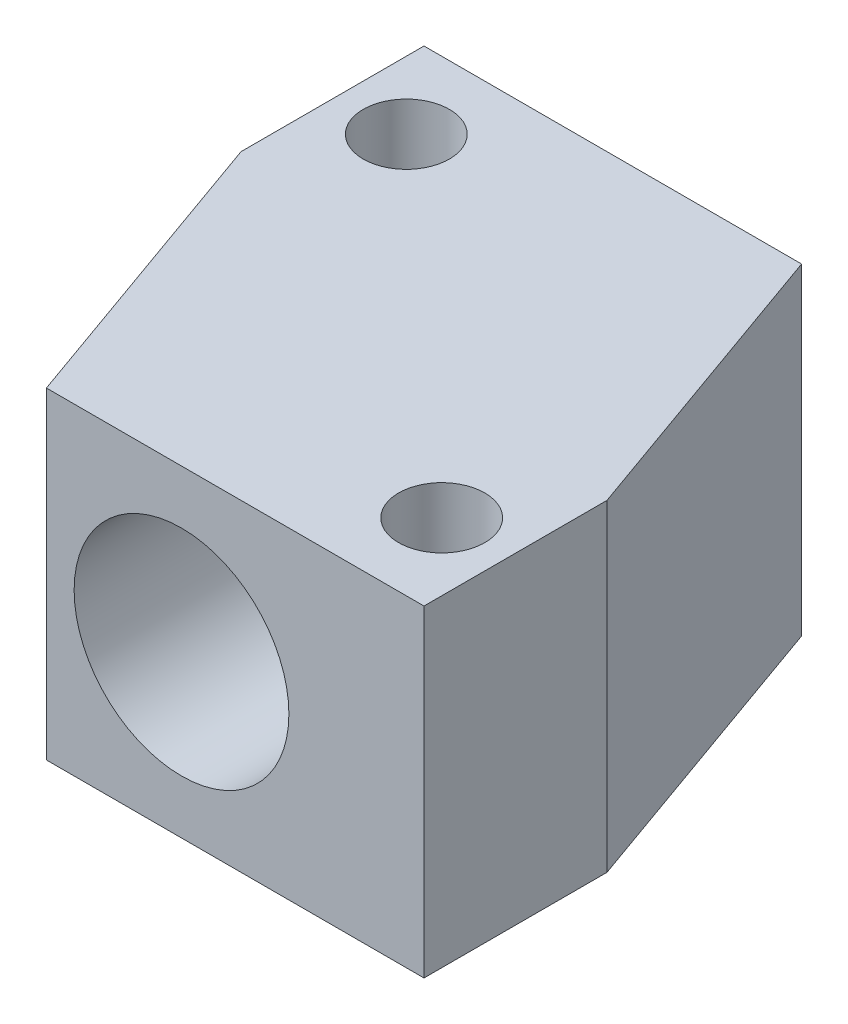
ISO-10303-21;
HEADER;
FILE_DESCRIPTION(('STEP AP214'),'2;1');
FILE_NAME('part.step','',(''),(''),'','','');
FILE_SCHEMA(('AUTOMOTIVE_DESIGN { 1 0 10303 214 1 1 1 1 }'));
ENDSEC;
DATA;
#1=APPLICATION_CONTEXT('core data for automotive mechanical design processes');
#2=APPLICATION_PROTOCOL_DEFINITION('international standard','automotive_design',2000,#1);
#3=PRODUCT_CONTEXT('',#1,'mechanical');
#4=PRODUCT('Part','Part','',(#3));
#5=PRODUCT_RELATED_PRODUCT_CATEGORY('part','',(#4));
#6=PRODUCT_DEFINITION_FORMATION('','',#4);
#7=PRODUCT_DEFINITION_CONTEXT('part definition',#1,'design');
#8=PRODUCT_DEFINITION('design','',#6,#7);
#9=PRODUCT_DEFINITION_SHAPE('','',#8);
#10=(LENGTH_UNIT() NAMED_UNIT(*) SI_UNIT(.MILLI.,.METRE.));
#11=(NAMED_UNIT(*) PLANE_ANGLE_UNIT() SI_UNIT($,.RADIAN.));
#12=(NAMED_UNIT(*) SI_UNIT($,.STERADIAN.) SOLID_ANGLE_UNIT());
#13=UNCERTAINTY_MEASURE_WITH_UNIT(LENGTH_MEASURE(1.E-05),#10,'distance_accuracy_value','');
#14=(GEOMETRIC_REPRESENTATION_CONTEXT(3) GLOBAL_UNCERTAINTY_ASSIGNED_CONTEXT((#13)) GLOBAL_UNIT_ASSIGNED_CONTEXT((#10,
#11,#12)) REPRESENTATION_CONTEXT('',''));
#15=CARTESIAN_POINT('',(0.,0.,0.));
#16=DIRECTION('',(0.,0.,1.));
#17=DIRECTION('',(1.,0.,0.));
#18=AXIS2_PLACEMENT_3D('',#15,#16,#17);
#19=CARTESIAN_POINT('',(-26.0675,-12.,-23.43));
#20=DIRECTION('',(0.,1.,0.));
#21=DIRECTION('',(0.,0.,1.));
#22=AXIS2_PLACEMENT_3D('',#19,#20,#21);
#23=CYLINDRICAL_SURFACE('',#22,3.39);
#24=CARTESIAN_POINT('',(-26.0675,-36.,-23.43));
#25=DIRECTION('',(0.,1.,0.));
#26=DIRECTION('',(0.,0.,1.));
#27=AXIS2_PLACEMENT_3D('',#24,#25,#26);
#28=CIRCLE('',#27,3.39);
#29=CARTESIAN_POINT('',(-26.0675,-36.,-20.04));
#30=VERTEX_POINT('',#29);
#31=EDGE_CURVE('E125',#30,#30,#28,.T.);
#32=ORIENTED_EDGE('',*,*,#31,.F.);
#33=EDGE_LOOP('',(#32));
#34=FACE_BOUND('',#33,.T.);
#35=CARTESIAN_POINT('',(-26.0675,1.58,-23.43));
#36=DIRECTION('',(0.,1.,0.));
#37=DIRECTION('',(0.,0.,1.));
#38=AXIS2_PLACEMENT_3D('',#35,#36,#37);
#39=CIRCLE('',#38,3.39);
#40=CARTESIAN_POINT('',(-26.0675,1.58,-20.04));
#41=VERTEX_POINT('',#40);
#42=EDGE_CURVE('E155',#41,#41,#39,.F.);
#43=ORIENTED_EDGE('',*,*,#42,.F.);
#44=EDGE_LOOP('',(#43));
#45=FACE_BOUND('',#44,.T.);
#46=ADVANCED_FACE('F38',(#34,#45),#23,.F.);
#47=CARTESIAN_POINT('',(0.,0.,36.13));
#48=DIRECTION('',(0.,0.,1.));
#49=DIRECTION('',(1.,0.,0.));
#50=AXIS2_PLACEMENT_3D('',#47,#48,#49);
#51=PLANE('',#50);
#52=DIRECTION('',(0.,1.,0.));
#53=VECTOR('',#52,1.);
#54=CARTESIAN_POINT('',(-20.13,-36.,36.13));
#55=LINE('',#54,#53);
#56=CARTESIAN_POINT('',(-20.13,-36.,36.13));
#57=VERTEX_POINT('',#56);
#58=CARTESIAN_POINT('',(-20.13,12.,36.13));
#59=VERTEX_POINT('',#58);
#60=EDGE_CURVE('E94',#57,#59,#55,.T.);
#61=ORIENTED_EDGE('',*,*,#60,.F.);
#62=DIRECTION('',(-1.,0.,0.));
#63=VECTOR('',#62,1.);
#64=CARTESIAN_POINT('',(-36.13,-36.,36.13));
#65=LINE('',#64,#63);
#66=CARTESIAN_POINT('',(36.13,-36.,36.13));
#67=VERTEX_POINT('',#66);
#68=EDGE_CURVE('E108',#67,#57,#65,.T.);
#69=ORIENTED_EDGE('',*,*,#68,.F.);
#70=DIRECTION('',(0.,1.,0.));
#71=VECTOR('',#70,1.);
#72=CARTESIAN_POINT('',(36.13,12.,36.13));
#73=LINE('',#72,#71);
#74=CARTESIAN_POINT('',(36.13,12.,36.13));
#75=VERTEX_POINT('',#74);
#76=EDGE_CURVE('E142',#67,#75,#73,.T.);
#77=ORIENTED_EDGE('',*,*,#76,.T.);
#78=DIRECTION('',(-1.,0.,0.));
#79=VECTOR('',#78,1.);
#80=CARTESIAN_POINT('',(-36.13,12.,36.13));
#81=LINE('',#80,#79);
#82=EDGE_CURVE('E109',#75,#59,#81,.T.);
#83=ORIENTED_EDGE('',*,*,#82,.T.);
#84=EDGE_LOOP('',(#61,#69,#77,#83));
#85=FACE_BOUND('',#84,.T.);
#86=CARTESIAN_POINT('',(0.,-12.,36.13));
#87=DIRECTION('',(0.,0.,1.));
#88=DIRECTION('',(1.,0.,0.));
#89=AXIS2_PLACEMENT_3D('',#86,#87,#88);
#90=CIRCLE('',#89,16.);
#91=CARTESIAN_POINT('',(16.,-12.,36.13));
#92=VERTEX_POINT('',#91);
#93=EDGE_CURVE('E133',#92,#92,#90,.T.);
#94=ORIENTED_EDGE('',*,*,#93,.F.);
#95=EDGE_LOOP('',(#94));
#96=FACE_BOUND('',#95,.T.);
#97=ADVANCED_FACE('F105',(#85,#96),#51,.T.);
#98=CARTESIAN_POINT('',(0.,0.,-36.13));
#99=DIRECTION('',(0.,0.,1.));
#100=DIRECTION('',(1.,0.,0.));
#101=AXIS2_PLACEMENT_3D('',#98,#99,#100);
#102=PLANE('',#101);
#103=DIRECTION('',(-1.,0.,0.));
#104=VECTOR('',#103,1.);
#105=CARTESIAN_POINT('',(-36.13,12.,-36.13));
#106=LINE('',#105,#104);
#107=CARTESIAN_POINT('',(20.13,12.,-36.13));
#108=VERTEX_POINT('',#107);
#109=CARTESIAN_POINT('',(-36.13,12.,-36.13));
#110=VERTEX_POINT('',#109);
#111=EDGE_CURVE('E138',#108,#110,#106,.T.);
#112=ORIENTED_EDGE('',*,*,#111,.F.);
#113=DIRECTION('',(0.,1.,0.));
#114=VECTOR('',#113,1.);
#115=CARTESIAN_POINT('',(20.13,-36.,-36.13));
#116=LINE('',#115,#114);
#117=CARTESIAN_POINT('',(20.13,-36.,-36.13));
#118=VERTEX_POINT('',#117);
#119=EDGE_CURVE('E174',#118,#108,#116,.T.);
#120=ORIENTED_EDGE('',*,*,#119,.F.);
#121=DIRECTION('',(-1.,0.,0.));
#122=VECTOR('',#121,1.);
#123=CARTESIAN_POINT('',(-36.13,-36.,-36.13));
#124=LINE('',#123,#122);
#125=CARTESIAN_POINT('',(-36.13,-36.,-36.13));
#126=VERTEX_POINT('',#125);
#127=EDGE_CURVE('E118',#118,#126,#124,.T.);
#128=ORIENTED_EDGE('',*,*,#127,.T.);
#129=DIRECTION('',(0.,-1.,0.));
#130=VECTOR('',#129,1.);
#131=CARTESIAN_POINT('',(-36.13,12.,-36.13));
#132=LINE('',#131,#130);
#133=EDGE_CURVE('E145',#110,#126,#132,.T.);
#134=ORIENTED_EDGE('',*,*,#133,.F.);
#135=EDGE_LOOP('',(#112,#120,#128,#134));
#136=FACE_BOUND('',#135,.T.);
#137=CARTESIAN_POINT('',(0.,-12.,-36.13));
#138=DIRECTION('',(0.,0.,1.));
#139=DIRECTION('',(1.,0.,0.));
#140=AXIS2_PLACEMENT_3D('',#137,#138,#139);
#141=CIRCLE('',#140,16.);
#142=CARTESIAN_POINT('',(16.,-12.,-36.13));
#143=VERTEX_POINT('',#142);
#144=EDGE_CURVE('E134',#143,#143,#141,.T.);
#145=ORIENTED_EDGE('',*,*,#144,.T.);
#146=EDGE_LOOP('',(#145));
#147=FACE_BOUND('',#146,.T.);
#148=ADVANCED_FACE('F213',(#136,#147),#102,.F.);
#149=CARTESIAN_POINT('',(36.13,12.,36.13));
#150=DIRECTION('',(-1.,0.,0.));
#151=DIRECTION('',(0.,0.,1.));
#152=AXIS2_PLACEMENT_3D('',#149,#150,#151);
#153=PLANE('',#152);
#154=DIRECTION('',(0.,0.,-1.));
#155=VECTOR('',#154,1.);
#156=CARTESIAN_POINT('',(36.13,-36.,36.13));
#157=LINE('',#156,#155);
#158=CARTESIAN_POINT('',(36.13,-36.,8.86999999999997));
#159=VERTEX_POINT('',#158);
#160=EDGE_CURVE('E116',#67,#159,#157,.T.);
#161=ORIENTED_EDGE('',*,*,#160,.T.);
#162=DIRECTION('',(0.,1.,0.));
#163=VECTOR('',#162,1.);
#164=CARTESIAN_POINT('',(36.13,-36.,8.87));
#165=LINE('',#164,#163);
#166=CARTESIAN_POINT('',(36.13,12.,8.87));
#167=VERTEX_POINT('',#166);
#168=EDGE_CURVE('E64',#159,#167,#165,.T.);
#169=ORIENTED_EDGE('',*,*,#168,.T.);
#170=DIRECTION('',(0.,0.,-1.));
#171=VECTOR('',#170,1.);
#172=CARTESIAN_POINT('',(36.13,12.,36.13));
#173=LINE('',#172,#171);
#174=EDGE_CURVE('E11',#75,#167,#173,.T.);
#175=ORIENTED_EDGE('',*,*,#174,.F.);
#176=ORIENTED_EDGE('',*,*,#76,.F.);
#177=EDGE_LOOP('',(#161,#169,#175,#176));
#178=FACE_BOUND('',#177,.T.);
#179=ADVANCED_FACE('F40',(#178),#153,.F.);
#180=CARTESIAN_POINT('',(-36.13,12.,36.13));
#181=DIRECTION('',(0.,-1.,0.));
#182=DIRECTION('',(0.,0.,-1.));
#183=AXIS2_PLACEMENT_3D('',#180,#181,#182);
#184=PLANE('',#183);
#185=CARTESIAN_POINT('',(-26.0675,12.,-23.43));
#186=DIRECTION('',(0.,1.,0.));
#187=DIRECTION('',(0.,0.,1.));
#188=AXIS2_PLACEMENT_3D('',#185,#186,#187);
#189=CIRCLE('',#188,6.42);
#190=CARTESIAN_POINT('',(-26.0675,12.,-17.01));
#191=VERTEX_POINT('',#190);
#192=EDGE_CURVE('E165',#191,#191,#189,.T.);
#193=ORIENTED_EDGE('',*,*,#192,.F.);
#194=EDGE_LOOP('',(#193));
#195=FACE_BOUND('',#194,.T.);
#196=CARTESIAN_POINT('',(26.0675,12.,23.43));
#197=DIRECTION('',(0.,1.,0.));
#198=DIRECTION('',(0.,0.,-1.));
#199=AXIS2_PLACEMENT_3D('',#196,#197,#198);
#200=CIRCLE('',#199,6.42);
#201=CARTESIAN_POINT('',(26.0675,12.,17.01));
#202=VERTEX_POINT('',#201);
#203=EDGE_CURVE('E180',#202,#202,#200,.T.);
#204=ORIENTED_EDGE('',*,*,#203,.F.);
#205=EDGE_LOOP('',(#204));
#206=FACE_BOUND('',#205,.T.);
#207=DIRECTION('',(0.,0.,-1.));
#208=VECTOR('',#207,1.);
#209=CARTESIAN_POINT('',(-36.13,12.,36.13));
#210=LINE('',#209,#208);
#211=CARTESIAN_POINT('',(-36.13,12.,-8.87));
#212=VERTEX_POINT('',#211);
#213=EDGE_CURVE('E48',#212,#110,#210,.T.);
#214=ORIENTED_EDGE('',*,*,#213,.F.);
#215=DIRECTION('',(-0.335009667654806,0.,-0.942214690279141));
#216=VECTOR('',#215,1.);
#217=CARTESIAN_POINT('',(-20.13,12.,36.13));
#218=LINE('',#217,#216);
#219=EDGE_CURVE('E100',#59,#212,#218,.T.);
#220=ORIENTED_EDGE('',*,*,#219,.F.);
#221=ORIENTED_EDGE('',*,*,#82,.F.);
#222=ORIENTED_EDGE('',*,*,#174,.T.);
#223=DIRECTION('',(0.335009667654806,0.,0.942214690279141));
#224=VECTOR('',#223,1.);
#225=CARTESIAN_POINT('',(36.13,12.,8.87));
#226=LINE('',#225,#224);
#227=EDGE_CURVE('E361',#108,#167,#226,.T.);
#228=ORIENTED_EDGE('',*,*,#227,.F.);
#229=ORIENTED_EDGE('',*,*,#111,.T.);
#230=EDGE_LOOP('',(#214,#220,#221,#222,#228,#229));
#231=FACE_BOUND('',#230,.T.);
#232=ADVANCED_FACE('F270',(#195,#206,#231),#184,.F.);
#233=CARTESIAN_POINT('',(-36.13,12.,36.13));
#234=DIRECTION('',(1.,0.,0.));
#235=DIRECTION('',(0.,0.,-1.));
#236=AXIS2_PLACEMENT_3D('',#233,#234,#235);
#237=PLANE('',#236);
#238=DIRECTION('',(0.,0.,-1.));
#239=VECTOR('',#238,1.);
#240=CARTESIAN_POINT('',(-36.13,-36.,36.13));
#241=LINE('',#240,#239);
#242=CARTESIAN_POINT('',(-36.13,-36.,-8.86999999999999));
#243=VERTEX_POINT('',#242);
#244=EDGE_CURVE('E122',#243,#126,#241,.T.);
#245=ORIENTED_EDGE('',*,*,#244,.F.);
#246=DIRECTION('',(0.,1.,0.));
#247=VECTOR('',#246,1.);
#248=CARTESIAN_POINT('',(-36.13,-36.,-8.87));
#249=LINE('',#248,#247);
#250=EDGE_CURVE('E56',#243,#212,#249,.T.);
#251=ORIENTED_EDGE('',*,*,#250,.T.);
#252=ORIENTED_EDGE('',*,*,#213,.T.);
#253=ORIENTED_EDGE('',*,*,#133,.T.);
#254=EDGE_LOOP('',(#245,#251,#252,#253));
#255=FACE_BOUND('',#254,.T.);
#256=ADVANCED_FACE('F203',(#255),#237,.F.);
#257=CARTESIAN_POINT('',(0.,-12.,-36.13));
#258=DIRECTION('',(0.,0.,1.));
#259=DIRECTION('',(1.,0.,0.));
#260=AXIS2_PLACEMENT_3D('',#257,#258,#259);
#261=CYLINDRICAL_SURFACE('',#260,16.);
#262=ORIENTED_EDGE('',*,*,#93,.T.);
#263=EDGE_LOOP('',(#262));
#264=FACE_BOUND('',#263,.T.);
#265=ORIENTED_EDGE('',*,*,#144,.F.);
#266=EDGE_LOOP('',(#265));
#267=FACE_BOUND('',#266,.T.);
#268=ADVANCED_FACE('F193',(#264,#267),#261,.F.);
#269=CARTESIAN_POINT('',(26.0675,-12.,23.43));
#270=DIRECTION('',(0.,1.,0.));
#271=DIRECTION('',(0.,0.,1.));
#272=AXIS2_PLACEMENT_3D('',#269,#270,#271);
#273=CYLINDRICAL_SURFACE('',#272,3.39);
#274=CARTESIAN_POINT('',(26.0675,1.58,23.43));
#275=DIRECTION('',(0.,-1.,0.));
#276=DIRECTION('',(0.,0.,-1.));
#277=AXIS2_PLACEMENT_3D('',#274,#275,#276);
#278=CIRCLE('',#277,3.39);
#279=CARTESIAN_POINT('',(26.0675,1.58,20.04));
#280=VERTEX_POINT('',#279);
#281=EDGE_CURVE('E42',#280,#280,#278,.F.);
#282=ORIENTED_EDGE('',*,*,#281,.T.);
#283=EDGE_LOOP('',(#282));
#284=FACE_BOUND('',#283,.T.);
#285=CARTESIAN_POINT('',(26.0675,-36.,23.43));
#286=DIRECTION('',(0.,1.,0.));
#287=DIRECTION('',(0.,0.,-1.));
#288=AXIS2_PLACEMENT_3D('',#285,#286,#287);
#289=CIRCLE('',#288,3.39);
#290=CARTESIAN_POINT('',(26.0675,-36.,20.04));
#291=VERTEX_POINT('',#290);
#292=EDGE_CURVE('E128',#291,#291,#289,.T.);
#293=ORIENTED_EDGE('',*,*,#292,.F.);
#294=EDGE_LOOP('',(#293));
#295=FACE_BOUND('',#294,.T.);
#296=ADVANCED_FACE('F191',(#284,#295),#273,.F.);
#297=CARTESIAN_POINT('',(-36.13,-36.,36.13));
#298=DIRECTION('',(0.,-1.,0.));
#299=DIRECTION('',(0.,0.,-1.));
#300=AXIS2_PLACEMENT_3D('',#297,#298,#299);
#301=PLANE('',#300);
#302=DIRECTION('',(-0.335009667654806,0.,-0.942214690279141));
#303=VECTOR('',#302,1.);
#304=CARTESIAN_POINT('',(-20.13,-36.,36.13));
#305=LINE('',#304,#303);
#306=EDGE_CURVE('E91',#57,#243,#305,.T.);
#307=ORIENTED_EDGE('',*,*,#306,.T.);
#308=ORIENTED_EDGE('',*,*,#244,.T.);
#309=ORIENTED_EDGE('',*,*,#127,.F.);
#310=DIRECTION('',(0.335009667654806,0.,0.942214690279141));
#311=VECTOR('',#310,1.);
#312=CARTESIAN_POINT('',(36.13,-36.,8.87));
#313=LINE('',#312,#311);
#314=EDGE_CURVE('E366',#118,#159,#313,.T.);
#315=ORIENTED_EDGE('',*,*,#314,.T.);
#316=ORIENTED_EDGE('',*,*,#160,.F.);
#317=ORIENTED_EDGE('',*,*,#68,.T.);
#318=EDGE_LOOP('',(#307,#308,#309,#315,#316,#317));
#319=FACE_BOUND('',#318,.T.);
#320=ORIENTED_EDGE('',*,*,#31,.T.);
#321=EDGE_LOOP('',(#320));
#322=FACE_BOUND('',#321,.T.);
#323=ORIENTED_EDGE('',*,*,#292,.T.);
#324=EDGE_LOOP('',(#323));
#325=FACE_BOUND('',#324,.T.);
#326=ADVANCED_FACE('F113',(#319,#322,#325),#301,.T.);
#327=CARTESIAN_POINT('',(-26.0675,1.58,-23.43));
#328=DIRECTION('',(0.,1.,0.));
#329=DIRECTION('',(0.,0.,1.));
#330=AXIS2_PLACEMENT_3D('',#327,#328,#329);
#331=PLANE('',#330);
#332=CARTESIAN_POINT('',(-26.0675,1.58,-23.43));
#333=DIRECTION('',(0.,1.,0.));
#334=DIRECTION('',(0.,0.,1.));
#335=AXIS2_PLACEMENT_3D('',#332,#333,#334);
#336=CIRCLE('',#335,6.42);
#337=CARTESIAN_POINT('',(-26.0675,1.58,-17.01));
#338=VERTEX_POINT('',#337);
#339=EDGE_CURVE('E158',#338,#338,#336,.T.);
#340=ORIENTED_EDGE('',*,*,#339,.T.);
#341=EDGE_LOOP('',(#340));
#342=FACE_BOUND('',#341,.T.);
#343=ORIENTED_EDGE('',*,*,#42,.T.);
#344=EDGE_LOOP('',(#343));
#345=FACE_BOUND('',#344,.T.);
#346=ADVANCED_FACE('F201',(#342,#345),#331,.T.);
#347=CARTESIAN_POINT('',(-26.0675,1.58,-23.43));
#348=DIRECTION('',(0.,1.,0.));
#349=DIRECTION('',(0.,0.,1.));
#350=AXIS2_PLACEMENT_3D('',#347,#348,#349);
#351=CYLINDRICAL_SURFACE('',#350,6.42);
#352=ORIENTED_EDGE('',*,*,#339,.F.);
#353=EDGE_LOOP('',(#352));
#354=FACE_BOUND('',#353,.T.);
#355=ORIENTED_EDGE('',*,*,#192,.T.);
#356=EDGE_LOOP('',(#355));
#357=FACE_BOUND('',#356,.T.);
#358=ADVANCED_FACE('F225',(#354,#357),#351,.F.);
#359=CARTESIAN_POINT('',(26.0675,1.58,23.43));
#360=DIRECTION('',(0.,-1.,0.));
#361=DIRECTION('',(0.,0.,-1.));
#362=AXIS2_PLACEMENT_3D('',#359,#360,#361);
#363=PLANE('',#362);
#364=CARTESIAN_POINT('',(26.0675,1.58,23.43));
#365=DIRECTION('',(0.,1.,0.));
#366=DIRECTION('',(0.,0.,-1.));
#367=AXIS2_PLACEMENT_3D('',#364,#365,#366);
#368=CIRCLE('',#367,6.42);
#369=CARTESIAN_POINT('',(26.0675,1.58,17.01));
#370=VERTEX_POINT('',#369);
#371=EDGE_CURVE('E171',#370,#370,#368,.T.);
#372=ORIENTED_EDGE('',*,*,#371,.T.);
#373=EDGE_LOOP('',(#372));
#374=FACE_BOUND('',#373,.T.);
#375=ORIENTED_EDGE('',*,*,#281,.F.);
#376=EDGE_LOOP('',(#375));
#377=FACE_BOUND('',#376,.T.);
#378=ADVANCED_FACE('F221',(#374,#377),#363,.F.);
#379=CARTESIAN_POINT('',(26.0675,1.58,23.43));
#380=DIRECTION('',(0.,1.,0.));
#381=DIRECTION('',(0.,0.,1.));
#382=AXIS2_PLACEMENT_3D('',#379,#380,#381);
#383=CYLINDRICAL_SURFACE('',#382,6.42);
#384=ORIENTED_EDGE('',*,*,#371,.F.);
#385=EDGE_LOOP('',(#384));
#386=FACE_BOUND('',#385,.T.);
#387=ORIENTED_EDGE('',*,*,#203,.T.);
#388=EDGE_LOOP('',(#387));
#389=FACE_BOUND('',#388,.T.);
#390=ADVANCED_FACE('F217',(#386,#389),#383,.F.);
#391=CARTESIAN_POINT('',(36.13,-36.,8.87));
#392=DIRECTION('',(-0.94221469027914,0.,0.335009667654806));
#393=DIRECTION('',(0.335009667654806,0.,0.942214690279141));
#394=AXIS2_PLACEMENT_3D('',#391,#392,#393);
#395=PLANE('',#394);
#396=ORIENTED_EDGE('',*,*,#227,.T.);
#397=ORIENTED_EDGE('',*,*,#168,.F.);
#398=ORIENTED_EDGE('',*,*,#314,.F.);
#399=ORIENTED_EDGE('',*,*,#119,.T.);
#400=EDGE_LOOP('',(#396,#397,#398,#399));
#401=FACE_BOUND('',#400,.T.);
#402=ADVANCED_FACE('F220',(#401),#395,.F.);
#403=CARTESIAN_POINT('',(-20.13,-36.,36.13));
#404=DIRECTION('',(0.942214690279141,0.,-0.335009667654806));
#405=DIRECTION('',(-0.335009667654806,0.,-0.942214690279141));
#406=AXIS2_PLACEMENT_3D('',#403,#404,#405);
#407=PLANE('',#406);
#408=ORIENTED_EDGE('',*,*,#219,.T.);
#409=ORIENTED_EDGE('',*,*,#250,.F.);
#410=ORIENTED_EDGE('',*,*,#306,.F.);
#411=ORIENTED_EDGE('',*,*,#60,.T.);
#412=EDGE_LOOP('',(#408,#409,#410,#411));
#413=FACE_BOUND('',#412,.T.);
#414=ADVANCED_FACE('F93',(#413),#407,.F.);
#415=CLOSED_SHELL('',(#46,#97,#148,#179,#232,#256,#268,#296,#326,#346,#358,#378,#390,#402,#414));
#416=MANIFOLD_SOLID_BREP('B2',#415);
#417=ADVANCED_BREP_SHAPE_REPRESENTATION('',(#18,#416),#14);
#418=SHAPE_DEFINITION_REPRESENTATION(#9,#417);
ENDSEC;
END-ISO-10303-21;
